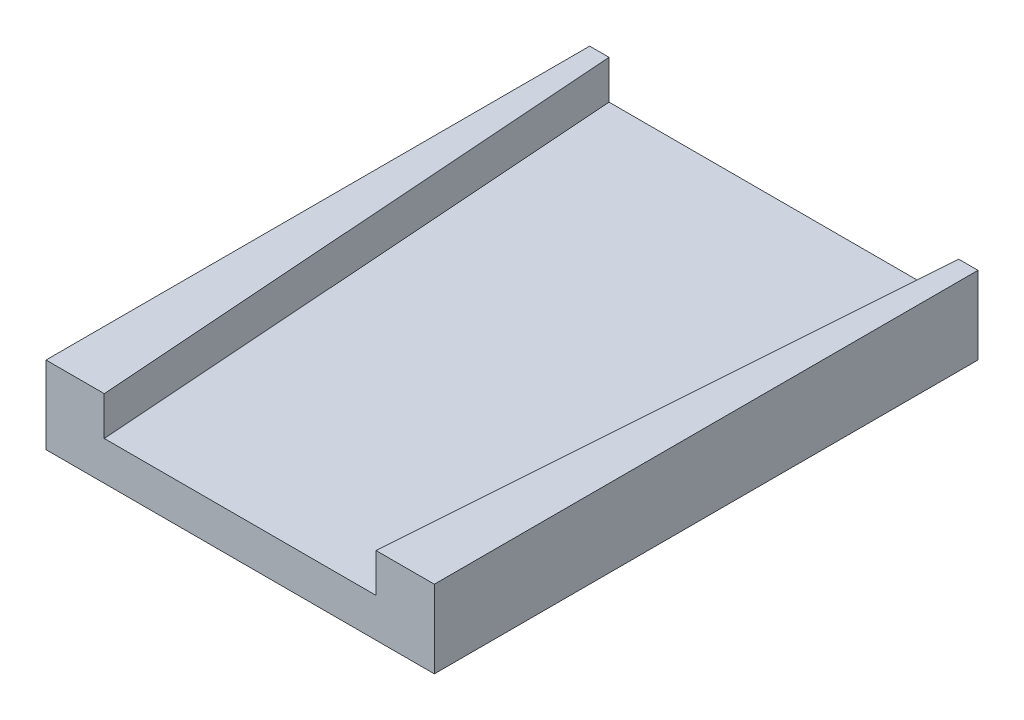
ISO-10303-21;
HEADER;
FILE_DESCRIPTION(('STEP AP214'),'2;1');
FILE_NAME('part.step','',(''),(''),'','','');
FILE_SCHEMA(('AUTOMOTIVE_DESIGN { 1 0 10303 214 1 1 1 1 }'));
ENDSEC;
DATA;
#1=APPLICATION_CONTEXT('core data for automotive mechanical design processes');
#2=APPLICATION_PROTOCOL_DEFINITION('international standard','automotive_design',2000,#1);
#3=PRODUCT_CONTEXT('',#1,'mechanical');
#4=PRODUCT('Part','Part','',(#3));
#5=PRODUCT_RELATED_PRODUCT_CATEGORY('part','',(#4));
#6=PRODUCT_DEFINITION_FORMATION('','',#4);
#7=PRODUCT_DEFINITION_CONTEXT('part definition',#1,'design');
#8=PRODUCT_DEFINITION('design','',#6,#7);
#9=PRODUCT_DEFINITION_SHAPE('','',#8);
#10=(LENGTH_UNIT() NAMED_UNIT(*) SI_UNIT(.MILLI.,.METRE.));
#11=(NAMED_UNIT(*) PLANE_ANGLE_UNIT() SI_UNIT($,.RADIAN.));
#12=(NAMED_UNIT(*) SI_UNIT($,.STERADIAN.) SOLID_ANGLE_UNIT());
#13=UNCERTAINTY_MEASURE_WITH_UNIT(LENGTH_MEASURE(1.E-05),#10,'distance_accuracy_value','');
#14=(GEOMETRIC_REPRESENTATION_CONTEXT(3) GLOBAL_UNCERTAINTY_ASSIGNED_CONTEXT((#13)) GLOBAL_UNIT_ASSIGNED_CONTEXT((#10,
#11,#12)) REPRESENTATION_CONTEXT('',''));
#15=CARTESIAN_POINT('',(0.,0.,0.));
#16=DIRECTION('',(0.,0.,1.));
#17=DIRECTION('',(1.,0.,0.));
#18=AXIS2_PLACEMENT_3D('',#15,#16,#17);
#19=CARTESIAN_POINT('',(0.,25.4,0.));
#20=DIRECTION('',(0.,-1.,0.));
#21=DIRECTION('',(0.,0.,-1.));
#22=AXIS2_PLACEMENT_3D('',#19,#20,#21);
#23=PLANE('',#22);
#24=DIRECTION('',(1.,0.,0.));
#25=VECTOR('',#24,1.);
#26=CARTESIAN_POINT('',(-63.5,25.4,88.9));
#27=LINE('',#26,#25);
#28=CARTESIAN_POINT('',(-63.5,25.4,88.9));
#29=VERTEX_POINT('',#28);
#30=CARTESIAN_POINT('',(-44.45,25.4,88.9));
#31=VERTEX_POINT('',#30);
#32=EDGE_CURVE('E151',#29,#31,#27,.T.);
#33=ORIENTED_EDGE('',*,*,#32,.T.);
#34=DIRECTION('',(0.0712470499879097,0.,0.997458699830735));
#35=VECTOR('',#34,1.);
#36=CARTESIAN_POINT('',(-44.45,25.4,88.9));
#37=LINE('',#36,#35);
#38=CARTESIAN_POINT('',(-57.15,25.4,-88.9));
#39=VERTEX_POINT('',#38);
#40=EDGE_CURVE('E116',#39,#31,#37,.T.);
#41=ORIENTED_EDGE('',*,*,#40,.F.);
#42=DIRECTION('',(-1.,0.,0.));
#43=VECTOR('',#42,1.);
#44=CARTESIAN_POINT('',(-63.5,25.4,-88.9));
#45=LINE('',#44,#43);
#46=CARTESIAN_POINT('',(-63.5,25.4,-88.9));
#47=VERTEX_POINT('',#46);
#48=EDGE_CURVE('E147',#39,#47,#45,.T.);
#49=ORIENTED_EDGE('',*,*,#48,.T.);
#50=DIRECTION('',(0.,0.,1.));
#51=VECTOR('',#50,1.);
#52=CARTESIAN_POINT('',(-63.5,25.4,88.9));
#53=LINE('',#52,#51);
#54=EDGE_CURVE('E149',#47,#29,#53,.T.);
#55=ORIENTED_EDGE('',*,*,#54,.T.);
#56=EDGE_LOOP('',(#33,#41,#49,#55));
#57=FACE_BOUND('',#56,.T.);
#58=ADVANCED_FACE('F36',(#57),#23,.F.);
#59=CARTESIAN_POINT('',(63.5,25.4,88.9));
#60=DIRECTION('',(-1.,0.,0.));
#61=DIRECTION('',(0.,0.,1.));
#62=AXIS2_PLACEMENT_3D('',#59,#60,#61);
#63=PLANE('',#62);
#64=DIRECTION('',(0.,0.,-1.));
#65=VECTOR('',#64,1.);
#66=CARTESIAN_POINT('',(63.5,0.,88.9));
#67=LINE('',#66,#65);
#68=CARTESIAN_POINT('',(63.5,0.,88.9));
#69=VERTEX_POINT('',#68);
#70=CARTESIAN_POINT('',(63.5,0.,-88.9));
#71=VERTEX_POINT('',#70);
#72=EDGE_CURVE('E141',#69,#71,#67,.T.);
#73=ORIENTED_EDGE('',*,*,#72,.T.);
#74=DIRECTION('',(0.,-1.,0.));
#75=VECTOR('',#74,1.);
#76=CARTESIAN_POINT('',(63.5,25.4,-88.9));
#77=LINE('',#76,#75);
#78=CARTESIAN_POINT('',(63.5,25.4,-88.9));
#79=VERTEX_POINT('',#78);
#80=EDGE_CURVE('E11',#79,#71,#77,.T.);
#81=ORIENTED_EDGE('',*,*,#80,.F.);
#82=DIRECTION('',(0.,0.,-1.));
#83=VECTOR('',#82,1.);
#84=CARTESIAN_POINT('',(63.5,25.4,88.9));
#85=LINE('',#84,#83);
#86=CARTESIAN_POINT('',(63.5,25.4,88.9));
#87=VERTEX_POINT('',#86);
#88=EDGE_CURVE('E145',#87,#79,#85,.T.);
#89=ORIENTED_EDGE('',*,*,#88,.F.);
#90=DIRECTION('',(0.,-1.,0.));
#91=VECTOR('',#90,1.);
#92=CARTESIAN_POINT('',(63.5,25.4,88.9));
#93=LINE('',#92,#91);
#94=EDGE_CURVE('E153',#87,#69,#93,.T.);
#95=ORIENTED_EDGE('',*,*,#94,.T.);
#96=EDGE_LOOP('',(#73,#81,#89,#95));
#97=FACE_BOUND('',#96,.T.);
#98=ADVANCED_FACE('F38',(#97),#63,.F.);
#99=CARTESIAN_POINT('',(-63.5,25.4,-88.9));
#100=DIRECTION('',(0.,0.,1.));
#101=DIRECTION('',(1.,0.,0.));
#102=AXIS2_PLACEMENT_3D('',#99,#100,#101);
#103=PLANE('',#102);
#104=ORIENTED_EDGE('',*,*,#48,.F.);
#105=DIRECTION('',(0.,1.,0.));
#106=VECTOR('',#105,1.);
#107=CARTESIAN_POINT('',(-57.15,12.7,-88.9));
#108=LINE('',#107,#106);
#109=CARTESIAN_POINT('',(-57.15,12.7,-88.9));
#110=VERTEX_POINT('',#109);
#111=EDGE_CURVE('E139',#110,#39,#108,.T.);
#112=ORIENTED_EDGE('',*,*,#111,.F.);
#113=DIRECTION('',(-1.,0.,0.));
#114=VECTOR('',#113,1.);
#115=CARTESIAN_POINT('',(-57.15,12.7,-88.9));
#116=LINE('',#115,#114);
#117=CARTESIAN_POINT('',(57.15,12.7,-88.9));
#118=VERTEX_POINT('',#117);
#119=EDGE_CURVE('E120',#118,#110,#116,.T.);
#120=ORIENTED_EDGE('',*,*,#119,.F.);
#121=DIRECTION('',(0.,1.,0.));
#122=VECTOR('',#121,1.);
#123=CARTESIAN_POINT('',(57.15,12.7,-88.9));
#124=LINE('',#123,#122);
#125=CARTESIAN_POINT('',(57.15,25.4,-88.9));
#126=VERTEX_POINT('',#125);
#127=EDGE_CURVE('E142',#118,#126,#124,.T.);
#128=ORIENTED_EDGE('',*,*,#127,.T.);
#129=EDGE_CURVE('E88',#79,#126,#45,.T.);
#130=ORIENTED_EDGE('',*,*,#129,.F.);
#131=ORIENTED_EDGE('',*,*,#80,.T.);
#132=DIRECTION('',(-1.,0.,0.));
#133=VECTOR('',#132,1.);
#134=CARTESIAN_POINT('',(-63.5,0.,-88.9));
#135=LINE('',#134,#133);
#136=CARTESIAN_POINT('',(-63.5,0.,-88.9));
#137=VERTEX_POINT('',#136);
#138=EDGE_CURVE('E156',#71,#137,#135,.T.);
#139=ORIENTED_EDGE('',*,*,#138,.T.);
#140=DIRECTION('',(0.,-1.,0.));
#141=VECTOR('',#140,1.);
#142=CARTESIAN_POINT('',(-63.5,25.4,-88.9));
#143=LINE('',#142,#141);
#144=EDGE_CURVE('E44',#47,#137,#143,.T.);
#145=ORIENTED_EDGE('',*,*,#144,.F.);
#146=EDGE_LOOP('',(#104,#112,#120,#128,#130,#131,#139,#145));
#147=FACE_BOUND('',#146,.T.);
#148=ADVANCED_FACE('F179',(#147),#103,.F.);
#149=CARTESIAN_POINT('',(-63.5,25.4,88.9));
#150=DIRECTION('',(1.,0.,0.));
#151=DIRECTION('',(0.,0.,-1.));
#152=AXIS2_PLACEMENT_3D('',#149,#150,#151);
#153=PLANE('',#152);
#154=DIRECTION('',(0.,0.,1.));
#155=VECTOR('',#154,1.);
#156=CARTESIAN_POINT('',(-63.5,0.,88.9));
#157=LINE('',#156,#155);
#158=CARTESIAN_POINT('',(-63.5,0.,88.9));
#159=VERTEX_POINT('',#158);
#160=EDGE_CURVE('E158',#137,#159,#157,.T.);
#161=ORIENTED_EDGE('',*,*,#160,.T.);
#162=DIRECTION('',(0.,-1.,0.));
#163=VECTOR('',#162,1.);
#164=CARTESIAN_POINT('',(-63.5,25.4,88.9));
#165=LINE('',#164,#163);
#166=EDGE_CURVE('E162',#29,#159,#165,.T.);
#167=ORIENTED_EDGE('',*,*,#166,.F.);
#168=ORIENTED_EDGE('',*,*,#54,.F.);
#169=ORIENTED_EDGE('',*,*,#144,.T.);
#170=EDGE_LOOP('',(#161,#167,#168,#169));
#171=FACE_BOUND('',#170,.T.);
#172=ADVANCED_FACE('F168',(#171),#153,.F.);
#173=CARTESIAN_POINT('',(-63.5,25.4,88.9));
#174=DIRECTION('',(0.,0.,-1.));
#175=DIRECTION('',(-1.,0.,0.));
#176=AXIS2_PLACEMENT_3D('',#173,#174,#175);
#177=PLANE('',#176);
#178=DIRECTION('',(1.,0.,0.));
#179=VECTOR('',#178,1.);
#180=CARTESIAN_POINT('',(44.45,12.7,88.9));
#181=LINE('',#180,#179);
#182=CARTESIAN_POINT('',(-44.45,12.7,88.9));
#183=VERTEX_POINT('',#182);
#184=CARTESIAN_POINT('',(44.45,12.7,88.9));
#185=VERTEX_POINT('',#184);
#186=EDGE_CURVE('E126',#183,#185,#181,.T.);
#187=ORIENTED_EDGE('',*,*,#186,.F.);
#188=DIRECTION('',(0.,1.,0.));
#189=VECTOR('',#188,1.);
#190=CARTESIAN_POINT('',(-44.45,12.7,88.9));
#191=LINE('',#190,#189);
#192=EDGE_CURVE('E110',#183,#31,#191,.T.);
#193=ORIENTED_EDGE('',*,*,#192,.T.);
#194=ORIENTED_EDGE('',*,*,#32,.F.);
#195=ORIENTED_EDGE('',*,*,#166,.T.);
#196=DIRECTION('',(1.,0.,0.));
#197=VECTOR('',#196,1.);
#198=CARTESIAN_POINT('',(-63.5,0.,88.9));
#199=LINE('',#198,#197);
#200=EDGE_CURVE('E81',#159,#69,#199,.T.);
#201=ORIENTED_EDGE('',*,*,#200,.T.);
#202=ORIENTED_EDGE('',*,*,#94,.F.);
#203=CARTESIAN_POINT('',(44.45,25.4,88.9));
#204=VERTEX_POINT('',#203);
#205=EDGE_CURVE('E59',#204,#87,#27,.T.);
#206=ORIENTED_EDGE('',*,*,#205,.F.);
#207=DIRECTION('',(0.,1.,0.));
#208=VECTOR('',#207,1.);
#209=CARTESIAN_POINT('',(44.45,12.7,88.9));
#210=LINE('',#209,#208);
#211=EDGE_CURVE('E51',#185,#204,#210,.T.);
#212=ORIENTED_EDGE('',*,*,#211,.F.);
#213=EDGE_LOOP('',(#187,#193,#194,#195,#201,#202,#206,#212));
#214=FACE_BOUND('',#213,.T.);
#215=ADVANCED_FACE('F131',(#214),#177,.F.);
#216=ORIENTED_EDGE('',*,*,#129,.T.);
#217=DIRECTION('',(0.0712470499879096,0.,-0.997458699830735));
#218=VECTOR('',#217,1.);
#219=CARTESIAN_POINT('',(57.15,25.4,-88.9));
#220=LINE('',#219,#218);
#221=EDGE_CURVE('E129',#204,#126,#220,.T.);
#222=ORIENTED_EDGE('',*,*,#221,.F.);
#223=ORIENTED_EDGE('',*,*,#205,.T.);
#224=ORIENTED_EDGE('',*,*,#88,.T.);
#225=EDGE_LOOP('',(#216,#222,#223,#224));
#226=FACE_BOUND('',#225,.T.);
#227=ADVANCED_FACE('F177',(#226),#23,.F.);
#228=CARTESIAN_POINT('',(0.,0.,0.));
#229=DIRECTION('',(0.,-1.,0.));
#230=DIRECTION('',(0.,0.,-1.));
#231=AXIS2_PLACEMENT_3D('',#228,#229,#230);
#232=PLANE('',#231);
#233=ORIENTED_EDGE('',*,*,#72,.F.);
#234=ORIENTED_EDGE('',*,*,#200,.F.);
#235=ORIENTED_EDGE('',*,*,#160,.F.);
#236=ORIENTED_EDGE('',*,*,#138,.F.);
#237=EDGE_LOOP('',(#233,#234,#235,#236));
#238=FACE_BOUND('',#237,.T.);
#239=ADVANCED_FACE('F173',(#238),#232,.T.);
#240=CARTESIAN_POINT('',(-44.45,12.7,88.9));
#241=DIRECTION('',(-0.997458699830735,0.,0.0712470499879097));
#242=DIRECTION('',(0.0712470499879097,0.,0.997458699830735));
#243=AXIS2_PLACEMENT_3D('',#240,#241,#242);
#244=PLANE('',#243);
#245=ORIENTED_EDGE('',*,*,#40,.T.);
#246=ORIENTED_EDGE('',*,*,#192,.F.);
#247=DIRECTION('',(0.0712470499879097,0.,0.997458699830735));
#248=VECTOR('',#247,1.);
#249=CARTESIAN_POINT('',(-44.45,12.7,88.9));
#250=LINE('',#249,#248);
#251=EDGE_CURVE('E113',#110,#183,#250,.T.);
#252=ORIENTED_EDGE('',*,*,#251,.F.);
#253=ORIENTED_EDGE('',*,*,#111,.T.);
#254=EDGE_LOOP('',(#245,#246,#252,#253));
#255=FACE_BOUND('',#254,.T.);
#256=ADVANCED_FACE('F112',(#255),#244,.F.);
#257=CARTESIAN_POINT('',(57.15,12.7,-88.9));
#258=DIRECTION('',(0.997458699830735,0.,0.0712470499879096));
#259=DIRECTION('',(0.0712470499879096,0.,-0.997458699830735));
#260=AXIS2_PLACEMENT_3D('',#257,#258,#259);
#261=PLANE('',#260);
#262=ORIENTED_EDGE('',*,*,#221,.T.);
#263=ORIENTED_EDGE('',*,*,#127,.F.);
#264=DIRECTION('',(0.0712470499879096,0.,-0.997458699830735));
#265=VECTOR('',#264,1.);
#266=CARTESIAN_POINT('',(57.15,12.7,-88.9));
#267=LINE('',#266,#265);
#268=EDGE_CURVE('E132',#185,#118,#267,.T.);
#269=ORIENTED_EDGE('',*,*,#268,.F.);
#270=ORIENTED_EDGE('',*,*,#211,.T.);
#271=EDGE_LOOP('',(#262,#263,#269,#270));
#272=FACE_BOUND('',#271,.T.);
#273=ADVANCED_FACE('F178',(#272),#261,.F.);
#274=CARTESIAN_POINT('',(0.,12.7,0.));
#275=DIRECTION('',(0.,-1.,0.));
#276=DIRECTION('',(0.,0.,-1.));
#277=AXIS2_PLACEMENT_3D('',#274,#275,#276);
#278=PLANE('',#277);
#279=ORIENTED_EDGE('',*,*,#251,.T.);
#280=ORIENTED_EDGE('',*,*,#186,.T.);
#281=ORIENTED_EDGE('',*,*,#268,.T.);
#282=ORIENTED_EDGE('',*,*,#119,.T.);
#283=EDGE_LOOP('',(#279,#280,#281,#282));
#284=FACE_BOUND('',#283,.T.);
#285=ADVANCED_FACE('F124',(#284),#278,.F.);
#286=CLOSED_SHELL('',(#58,#98,#148,#172,#215,#227,#239,#256,#273,#285));
#287=MANIFOLD_SOLID_BREP('B2',#286);
#288=ADVANCED_BREP_SHAPE_REPRESENTATION('',(#18,#287),#14);
#289=SHAPE_DEFINITION_REPRESENTATION(#9,#288);
ENDSEC;
END-ISO-10303-21;
